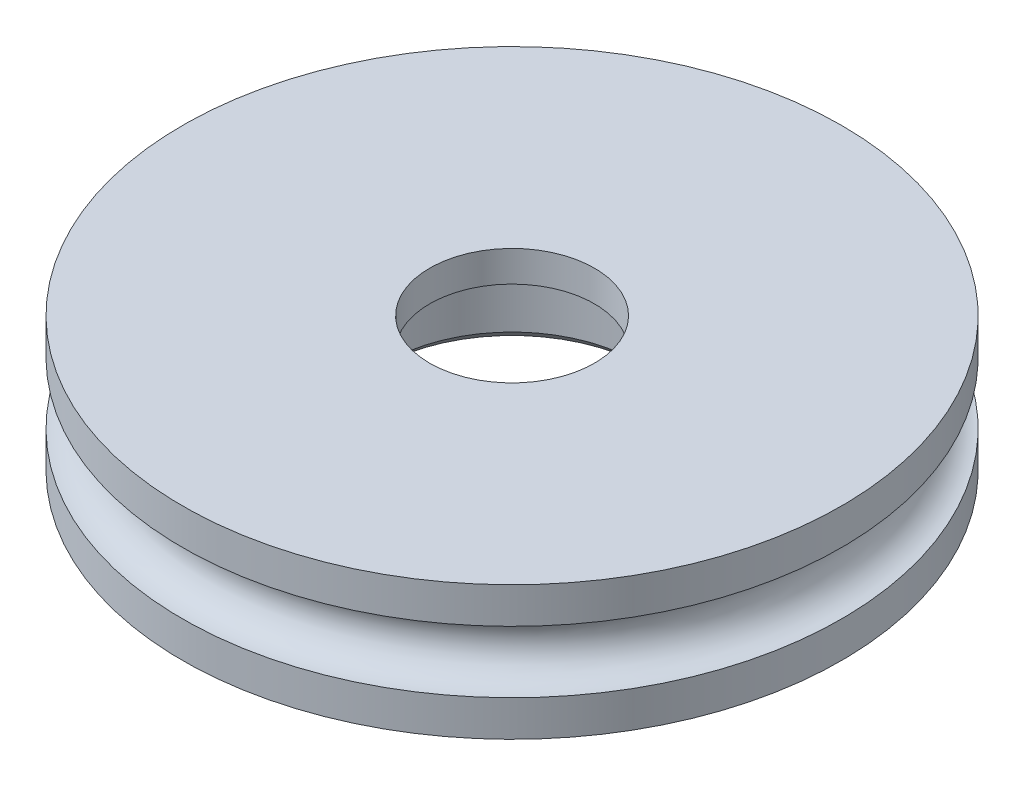
ISO-10303-21;
HEADER;
FILE_DESCRIPTION(('STEP AP214'),'2;1');
FILE_NAME('part.step','',(''),(''),'','','');
FILE_SCHEMA(('AUTOMOTIVE_DESIGN { 1 0 10303 214 1 1 1 1 }'));
ENDSEC;
DATA;
#1=APPLICATION_CONTEXT('core data for automotive mechanical design processes');
#2=APPLICATION_PROTOCOL_DEFINITION('international standard','automotive_design',2000,#1);
#3=PRODUCT_CONTEXT('',#1,'mechanical');
#4=PRODUCT('Part','Part','',(#3));
#5=PRODUCT_RELATED_PRODUCT_CATEGORY('part','',(#4));
#6=PRODUCT_DEFINITION_FORMATION('','',#4);
#7=PRODUCT_DEFINITION_CONTEXT('part definition',#1,'design');
#8=PRODUCT_DEFINITION('design','',#6,#7);
#9=PRODUCT_DEFINITION_SHAPE('','',#8);
#10=(LENGTH_UNIT() NAMED_UNIT(*) SI_UNIT(.MILLI.,.METRE.));
#11=(NAMED_UNIT(*) PLANE_ANGLE_UNIT() SI_UNIT($,.RADIAN.));
#12=(NAMED_UNIT(*) SI_UNIT($,.STERADIAN.) SOLID_ANGLE_UNIT());
#13=UNCERTAINTY_MEASURE_WITH_UNIT(LENGTH_MEASURE(1.E-05),#10,'distance_accuracy_value','');
#14=(GEOMETRIC_REPRESENTATION_CONTEXT(3) GLOBAL_UNCERTAINTY_ASSIGNED_CONTEXT((#13)) GLOBAL_UNIT_ASSIGNED_CONTEXT((#10,
#11,#12)) REPRESENTATION_CONTEXT('',''));
#15=CARTESIAN_POINT('',(0.,0.,0.));
#16=DIRECTION('',(0.,0.,1.));
#17=DIRECTION('',(1.,0.,0.));
#18=AXIS2_PLACEMENT_3D('',#15,#16,#17);
#19=CARTESIAN_POINT('',(0.,1.625,0.));
#20=DIRECTION('',(0.,-1.,0.));
#21=DIRECTION('',(0.,0.,-1.));
#22=AXIS2_PLACEMENT_3D('',#19,#20,#21);
#23=CYLINDRICAL_SURFACE('',#22,3.05);
#24=CARTESIAN_POINT('',(0.,-0.874999999999982,0.));
#25=DIRECTION('',(0.,-1.,0.));
#26=DIRECTION('',(0.,0.,-1.));
#27=AXIS2_PLACEMENT_3D('',#24,#25,#26);
#28=CIRCLE('',#27,3.05);
#29=CARTESIAN_POINT('',(0.,-0.874999999999982,-3.05));
#30=VERTEX_POINT('',#29);
#31=EDGE_CURVE('E43',#30,#30,#28,.T.);
#32=CARTESIAN_POINT('',(0.,0.875,0.));
#33=DIRECTION('',(0.,1.,0.));
#34=DIRECTION('',(0.,0.,1.));
#35=AXIS2_PLACEMENT_3D('',#32,#33,#34);
#36=CIRCLE('',#35,3.05);
#37=CARTESIAN_POINT('',(0.,0.875,-3.05));
#38=VERTEX_POINT('',#37);
#39=EDGE_CURVE('E54',#38,#38,#36,.T.);
#40=CARTESIAN_POINT('',(0.,-0.874999999999982,-3.05));
#41=CARTESIAN_POINT('',(0.,-0.856770833333315,-3.05));
#42=CARTESIAN_POINT('',(0.,-0.838541666666649,-3.05));
#43=CARTESIAN_POINT('',(0.,-0.802083333333316,-3.05));
#44=CARTESIAN_POINT('',(0.,-0.78385416666665,-3.05));
#45=CARTESIAN_POINT('',(0.,-0.747395833333317,-3.05));
#46=CARTESIAN_POINT('',(0.,-0.72916666666665,-3.05));
#47=CARTESIAN_POINT('',(0.,-0.692708333333317,-3.05));
#48=CARTESIAN_POINT('',(0.,-0.674479166666651,-3.05));
#49=CARTESIAN_POINT('',(0.,-0.638020833333318,-3.05));
#50=CARTESIAN_POINT('',(0.,-0.619791666666651,-3.05));
#51=CARTESIAN_POINT('',(0.,-0.583333333333318,-3.05));
#52=CARTESIAN_POINT('',(0.,-0.565104166666652,-3.05));
#53=CARTESIAN_POINT('',(0.,-0.528645833333319,-3.05));
#54=CARTESIAN_POINT('',(0.,-0.510416666666652,-3.05));
#55=CARTESIAN_POINT('',(0.,-0.473958333333319,-3.05));
#56=CARTESIAN_POINT('',(0.,-0.455729166666653,-3.05));
#57=CARTESIAN_POINT('',(0.,-0.41927083333332,-3.05));
#58=CARTESIAN_POINT('',(0.,-0.401041666666654,-3.05));
#59=CARTESIAN_POINT('',(0.,-0.364583333333321,-3.05));
#60=CARTESIAN_POINT('',(0.,-0.346354166666654,-3.05));
#61=CARTESIAN_POINT('',(0.,-0.309895833333321,-3.05));
#62=CARTESIAN_POINT('',(0.,-0.291666666666655,-3.05));
#63=CARTESIAN_POINT('',(0.,-0.255208333333322,-3.05));
#64=CARTESIAN_POINT('',(0.,-0.236979166666655,-3.05));
#65=CARTESIAN_POINT('',(0.,-0.200520833333322,-3.05));
#66=CARTESIAN_POINT('',(0.,-0.182291666666656,-3.05));
#67=CARTESIAN_POINT('',(0.,-0.145833333333323,-3.05));
#68=CARTESIAN_POINT('',(0.,-0.127604166666657,-3.05));
#69=CARTESIAN_POINT('',(0.,-0.0911458333333236,-3.05));
#70=CARTESIAN_POINT('',(0.,-0.0729166666666571,-3.05));
#71=CARTESIAN_POINT('',(0.,-0.036458333333324,-3.05));
#72=CARTESIAN_POINT('',(0.,-0.0182291666666576,-3.05));
#73=CARTESIAN_POINT('',(0.,0.0182291666666754,-3.05));
#74=CARTESIAN_POINT('',(0.,0.0364583333333418,-3.05));
#75=CARTESIAN_POINT('',(0.,0.0729166666666747,-3.05));
#76=CARTESIAN_POINT('',(0.,0.0911458333333412,-3.05));
#77=CARTESIAN_POINT('',(0.,0.127604166666674,-3.05));
#78=CARTESIAN_POINT('',(0.,0.145833333333341,-3.05));
#79=CARTESIAN_POINT('',(0.,0.182291666666674,-3.05));
#80=CARTESIAN_POINT('',(0.,0.20052083333334,-3.05));
#81=CARTESIAN_POINT('',(0.,0.236979166666673,-3.05));
#82=CARTESIAN_POINT('',(0.,0.25520833333334,-3.05));
#83=CARTESIAN_POINT('',(0.,0.291666666666673,-3.05));
#84=CARTESIAN_POINT('',(0.,0.309895833333339,-3.05));
#85=CARTESIAN_POINT('',(0.,0.346354166666672,-3.05));
#86=CARTESIAN_POINT('',(0.,0.364583333333338,-3.05));
#87=CARTESIAN_POINT('',(0.,0.401041666666671,-3.05));
#88=CARTESIAN_POINT('',(0.,0.419270833333338,-3.05));
#89=CARTESIAN_POINT('',(0.,0.455729166666671,-3.05));
#90=CARTESIAN_POINT('',(0.,0.473958333333337,-3.05));
#91=CARTESIAN_POINT('',(0.,0.51041666666667,-3.05));
#92=CARTESIAN_POINT('',(0.,0.528645833333337,-3.05));
#93=CARTESIAN_POINT('',(0.,0.56510416666667,-3.05));
#94=CARTESIAN_POINT('',(0.,0.583333333333336,-3.05));
#95=CARTESIAN_POINT('',(0.,0.619791666666669,-3.05));
#96=CARTESIAN_POINT('',(0.,0.638020833333336,-3.05));
#97=CARTESIAN_POINT('',(0.,0.674479166666669,-3.05));
#98=CARTESIAN_POINT('',(0.,0.692708333333335,-3.05));
#99=CARTESIAN_POINT('',(0.,0.729166666666668,-3.05));
#100=CARTESIAN_POINT('',(0.,0.747395833333334,-3.05));
#101=CARTESIAN_POINT('',(0.,0.783854166666668,-3.05));
#102=CARTESIAN_POINT('',(0.,0.802083333333334,-3.05));
#103=CARTESIAN_POINT('',(0.,0.838541666666667,-3.05));
#104=CARTESIAN_POINT('',(0.,0.856770833333333,-3.05));
#105=CARTESIAN_POINT('',(0.,0.875,-3.05));
#106=B_SPLINE_CURVE_WITH_KNOTS('',3,(#40,#41,#42,#43,#44,#45,#46,#47,#48,#49,#50,#51,#52,#53,
#54,#55,#56,#57,#58,#59,#60,#61,#62,#63,#64,#65,#66,#67,#68,#69,#70,#71,#72,#73,#74,#75,#76,#77,
#78,#79,#80,#81,#82,#83,#84,#85,#86,#87,#88,#89,#90,#91,#92,#93,#94,#95,#96,#97,#98,#99,#100,
#101,#102,#103,#104,#105),.UNSPECIFIED.,.F.,.F.,(4,2,2,2,2,2,2,2,2,2,2,2,2,2,2,2,2,2,2,2,2,2,2,
2,2,2,2,2,2,2,2,2,4),(0.,0.0546874999999996,0.109374999999999,0.164062499999998,
0.218749999999998,0.273437499999997,0.328124999999997,0.382812499999996,0.437499999999996,
0.492187499999995,0.546874999999994,0.601562499999994,0.656249999999993,0.710937499999993,
0.765624999999992,0.820312499999991,0.874999999999991,0.92968749999999,0.98437499999999,
1.03906249999999,1.09374999999999,1.14843749999999,1.20312499999999,1.25781249999999,
1.31249999999999,1.36718749999999,1.42187499999999,1.47656249999998,1.53124999999998,
1.58593749999998,1.64062499999998,1.69531249999998,1.74999999999998),.UNSPECIFIED.);
#107=EDGE_CURVE('BSEAM35',#30,#38,#106,.T.);
#108=ORIENTED_EDGE('',*,*,#31,.T.);
#109=ORIENTED_EDGE('',*,*,#39,.T.);
#110=ORIENTED_EDGE('',*,*,#107,.T.);
#111=ORIENTED_EDGE('',*,*,#107,.F.);
#112=EDGE_LOOP('',(#108,#110,#109,#111));
#113=FACE_BOUND('',#112,.T.);
#114=ADVANCED_FACE('F35',(#113),#23,.F.);
#115=CARTESIAN_POINT('',(0.,1.625,0.));
#116=DIRECTION('',(0.,-1.,0.));
#117=DIRECTION('',(0.,0.,-1.));
#118=AXIS2_PLACEMENT_3D('',#115,#116,#117);
#119=CYLINDRICAL_SURFACE('',#118,8.);
#120=CARTESIAN_POINT('',(0.,0.75,0.));
#121=DIRECTION('',(0.,1.,0.));
#122=DIRECTION('',(0.,0.,1.));
#123=AXIS2_PLACEMENT_3D('',#120,#121,#122);
#124=CIRCLE('',#123,8.);
#125=CARTESIAN_POINT('',(0.,0.75,-8.));
#126=VERTEX_POINT('',#125);
#127=EDGE_CURVE('E60',#126,#126,#124,.T.);
#128=CARTESIAN_POINT('',(0.,1.625,0.));
#129=DIRECTION('',(0.,1.,0.));
#130=DIRECTION('',(0.,0.,1.));
#131=AXIS2_PLACEMENT_3D('',#128,#129,#130);
#132=CIRCLE('',#131,8.);
#133=CARTESIAN_POINT('',(0.,1.625,-8.));
#134=VERTEX_POINT('',#133);
#135=EDGE_CURVE('E47',#134,#134,#132,.T.);
#136=CARTESIAN_POINT('',(0.,0.75,-8.));
#137=CARTESIAN_POINT('',(0.,0.759114583333333,-8.));
#138=CARTESIAN_POINT('',(0.,0.768229166666667,-8.));
#139=CARTESIAN_POINT('',(0.,0.786458333333333,-8.));
#140=CARTESIAN_POINT('',(0.,0.795572916666667,-8.));
#141=CARTESIAN_POINT('',(0.,0.813802083333333,-8.));
#142=CARTESIAN_POINT('',(0.,0.822916666666667,-8.));
#143=CARTESIAN_POINT('',(0.,0.841145833333333,-8.));
#144=CARTESIAN_POINT('',(0.,0.850260416666667,-8.));
#145=CARTESIAN_POINT('',(0.,0.868489583333333,-8.));
#146=CARTESIAN_POINT('',(0.,0.877604166666667,-8.));
#147=CARTESIAN_POINT('',(0.,0.895833333333333,-8.));
#148=CARTESIAN_POINT('',(0.,0.904947916666667,-8.));
#149=CARTESIAN_POINT('',(0.,0.923177083333333,-8.));
#150=CARTESIAN_POINT('',(0.,0.932291666666667,-8.));
#151=CARTESIAN_POINT('',(0.,0.950520833333333,-8.));
#152=CARTESIAN_POINT('',(0.,0.959635416666667,-8.));
#153=CARTESIAN_POINT('',(0.,0.977864583333333,-8.));
#154=CARTESIAN_POINT('',(0.,0.986979166666667,-8.));
#155=CARTESIAN_POINT('',(0.,1.00520833333333,-8.));
#156=CARTESIAN_POINT('',(0.,1.01432291666667,-8.));
#157=CARTESIAN_POINT('',(0.,1.03255208333333,-8.));
#158=CARTESIAN_POINT('',(0.,1.04166666666667,-8.));
#159=CARTESIAN_POINT('',(0.,1.05989583333333,-8.));
#160=CARTESIAN_POINT('',(0.,1.06901041666667,-8.));
#161=CARTESIAN_POINT('',(0.,1.08723958333333,-8.));
#162=CARTESIAN_POINT('',(0.,1.09635416666667,-8.));
#163=CARTESIAN_POINT('',(0.,1.11458333333333,-8.));
#164=CARTESIAN_POINT('',(0.,1.12369791666667,-8.));
#165=CARTESIAN_POINT('',(0.,1.14192708333333,-8.));
#166=CARTESIAN_POINT('',(0.,1.15104166666667,-8.));
#167=CARTESIAN_POINT('',(0.,1.16927083333333,-8.));
#168=CARTESIAN_POINT('',(0.,1.17838541666667,-8.));
#169=CARTESIAN_POINT('',(0.,1.19661458333333,-8.));
#170=CARTESIAN_POINT('',(0.,1.20572916666667,-8.));
#171=CARTESIAN_POINT('',(0.,1.22395833333333,-8.));
#172=CARTESIAN_POINT('',(0.,1.23307291666667,-8.));
#173=CARTESIAN_POINT('',(0.,1.25130208333333,-8.));
#174=CARTESIAN_POINT('',(0.,1.26041666666667,-8.));
#175=CARTESIAN_POINT('',(0.,1.27864583333333,-8.));
#176=CARTESIAN_POINT('',(0.,1.28776041666667,-8.));
#177=CARTESIAN_POINT('',(0.,1.30598958333333,-8.));
#178=CARTESIAN_POINT('',(0.,1.31510416666667,-8.));
#179=CARTESIAN_POINT('',(0.,1.33333333333333,-8.));
#180=CARTESIAN_POINT('',(0.,1.34244791666667,-8.));
#181=CARTESIAN_POINT('',(0.,1.36067708333333,-8.));
#182=CARTESIAN_POINT('',(0.,1.36979166666667,-8.));
#183=CARTESIAN_POINT('',(0.,1.38802083333333,-8.));
#184=CARTESIAN_POINT('',(0.,1.39713541666667,-8.));
#185=CARTESIAN_POINT('',(0.,1.41536458333333,-8.));
#186=CARTESIAN_POINT('',(0.,1.42447916666667,-8.));
#187=CARTESIAN_POINT('',(0.,1.44270833333333,-8.));
#188=CARTESIAN_POINT('',(0.,1.45182291666667,-8.));
#189=CARTESIAN_POINT('',(0.,1.47005208333333,-8.));
#190=CARTESIAN_POINT('',(0.,1.47916666666667,-8.));
#191=CARTESIAN_POINT('',(0.,1.49739583333333,-8.));
#192=CARTESIAN_POINT('',(0.,1.50651041666667,-8.));
#193=CARTESIAN_POINT('',(0.,1.52473958333333,-8.));
#194=CARTESIAN_POINT('',(0.,1.53385416666667,-8.));
#195=CARTESIAN_POINT('',(0.,1.55208333333333,-8.));
#196=CARTESIAN_POINT('',(0.,1.56119791666667,-8.));
#197=CARTESIAN_POINT('',(0.,1.57942708333333,-8.));
#198=CARTESIAN_POINT('',(0.,1.58854166666667,-8.));
#199=CARTESIAN_POINT('',(0.,1.60677083333333,-8.));
#200=CARTESIAN_POINT('',(0.,1.61588541666667,-8.));
#201=CARTESIAN_POINT('',(0.,1.625,-8.));
#202=B_SPLINE_CURVE_WITH_KNOTS('',3,(#136,#137,#138,#139,#140,#141,#142,#143,#144,#145,#146,
#147,#148,#149,#150,#151,#152,#153,#154,#155,#156,#157,#158,#159,#160,#161,#162,#163,#164,#165,
#166,#167,#168,#169,#170,#171,#172,#173,#174,#175,#176,#177,#178,#179,#180,#181,#182,#183,#184,
#185,#186,#187,#188,#189,#190,#191,#192,#193,#194,#195,#196,#197,#198,#199,#200,#201),
.UNSPECIFIED.,.F.,.F.,(4,2,2,2,2,2,2,2,2,2,2,2,2,2,2,2,2,2,2,2,2,2,2,2,2,2,2,2,2,2,2,2,4),(0.,
0.02734375,0.0546874999999999,0.08203125,0.109375,0.13671875,0.1640625,0.19140625,0.21875,
0.24609375,0.2734375,0.30078125,0.328125,0.35546875,0.3828125,0.41015625,0.4375,0.46484375,
0.4921875,0.51953125,0.546875,0.57421875,0.6015625,0.62890625,0.65625,0.68359375,0.7109375,
0.73828125,0.765625,0.79296875,0.8203125,0.84765625,0.875),.UNSPECIFIED.);
#203=EDGE_CURVE('BSEAM81',#126,#134,#202,.T.);
#204=ORIENTED_EDGE('',*,*,#127,.T.);
#205=ORIENTED_EDGE('',*,*,#135,.F.);
#206=ORIENTED_EDGE('',*,*,#203,.T.);
#207=ORIENTED_EDGE('',*,*,#203,.F.);
#208=EDGE_LOOP('',(#204,#206,#205,#207));
#209=FACE_BOUND('',#208,.T.);
#210=ADVANCED_FACE('F81',(#209),#119,.T.);
#211=CARTESIAN_POINT('',(0.,1.625,0.));
#212=DIRECTION('',(0.,1.,0.));
#213=DIRECTION('',(0.,0.,1.));
#214=AXIS2_PLACEMENT_3D('',#211,#212,#213);
#215=PLANE('',#214);
#216=ORIENTED_EDGE('',*,*,#135,.T.);
#217=EDGE_LOOP('',(#216));
#218=FACE_BOUND('',#217,.T.);
#219=CARTESIAN_POINT('',(0.,1.625,0.));
#220=DIRECTION('',(0.,1.,0.));
#221=DIRECTION('',(0.,0.,1.));
#222=AXIS2_PLACEMENT_3D('',#219,#220,#221);
#223=CIRCLE('',#222,2.);
#224=CARTESIAN_POINT('',(0.,1.625,2.));
#225=VERTEX_POINT('',#224);
#226=EDGE_CURVE('E68',#225,#225,#223,.T.);
#227=ORIENTED_EDGE('',*,*,#226,.F.);
#228=EDGE_LOOP('',(#227));
#229=FACE_BOUND('',#228,.T.);
#230=ADVANCED_FACE('F82',(#218,#229),#215,.T.);
#231=CARTESIAN_POINT('',(0.,-1.625,0.));
#232=DIRECTION('',(0.,1.,0.));
#233=DIRECTION('',(0.,0.,1.));
#234=AXIS2_PLACEMENT_3D('',#231,#232,#233);
#235=PLANE('',#234);
#236=CARTESIAN_POINT('',(0.,-1.625,0.));
#237=DIRECTION('',(0.,-1.,0.));
#238=DIRECTION('',(0.,0.,-1.));
#239=AXIS2_PLACEMENT_3D('',#236,#237,#238);
#240=CIRCLE('',#239,6.5);
#241=CARTESIAN_POINT('',(0.,-1.625,-6.5));
#242=VERTEX_POINT('',#241);
#243=EDGE_CURVE('E109',#242,#242,#240,.T.);
#244=ORIENTED_EDGE('',*,*,#243,.F.);
#245=EDGE_LOOP('',(#244));
#246=FACE_BOUND('',#245,.T.);
#247=CARTESIAN_POINT('',(0.,-1.625,0.));
#248=DIRECTION('',(0.,1.,0.));
#249=DIRECTION('',(0.,0.,1.));
#250=AXIS2_PLACEMENT_3D('',#247,#248,#249);
#251=CIRCLE('',#250,8.);
#252=CARTESIAN_POINT('',(0.,-1.625,-8.));
#253=VERTEX_POINT('',#252);
#254=EDGE_CURVE('E51',#253,#253,#251,.T.);
#255=ORIENTED_EDGE('',*,*,#254,.F.);
#256=EDGE_LOOP('',(#255));
#257=FACE_BOUND('',#256,.T.);
#258=ADVANCED_FACE('F85',(#246,#257),#235,.F.);
#259=CARTESIAN_POINT('',(0.,-0.75,0.));
#260=DIRECTION('',(0.,1.,0.));
#261=DIRECTION('',(0.,0.,1.));
#262=AXIS2_PLACEMENT_3D('',#259,#260,#261);
#263=CIRCLE('',#262,8.);
#264=CARTESIAN_POINT('',(0.,-0.75,-8.));
#265=VERTEX_POINT('',#264);
#266=EDGE_CURVE('E57',#265,#265,#263,.T.);
#267=CARTESIAN_POINT('',(0.,-0.75,-8.));
#268=CARTESIAN_POINT('',(0.,-0.759114583333333,-8.));
#269=CARTESIAN_POINT('',(0.,-0.768229166666667,-8.));
#270=CARTESIAN_POINT('',(0.,-0.786458333333333,-8.));
#271=CARTESIAN_POINT('',(0.,-0.795572916666667,-8.));
#272=CARTESIAN_POINT('',(0.,-0.813802083333333,-8.));
#273=CARTESIAN_POINT('',(0.,-0.822916666666667,-8.));
#274=CARTESIAN_POINT('',(0.,-0.841145833333333,-8.));
#275=CARTESIAN_POINT('',(0.,-0.850260416666667,-8.));
#276=CARTESIAN_POINT('',(0.,-0.868489583333333,-8.));
#277=CARTESIAN_POINT('',(0.,-0.877604166666667,-8.));
#278=CARTESIAN_POINT('',(0.,-0.895833333333333,-8.));
#279=CARTESIAN_POINT('',(0.,-0.904947916666667,-8.));
#280=CARTESIAN_POINT('',(0.,-0.923177083333333,-8.));
#281=CARTESIAN_POINT('',(0.,-0.932291666666667,-8.));
#282=CARTESIAN_POINT('',(0.,-0.950520833333333,-8.));
#283=CARTESIAN_POINT('',(0.,-0.959635416666667,-8.));
#284=CARTESIAN_POINT('',(0.,-0.977864583333333,-8.));
#285=CARTESIAN_POINT('',(0.,-0.986979166666667,-8.));
#286=CARTESIAN_POINT('',(0.,-1.00520833333333,-8.));
#287=CARTESIAN_POINT('',(0.,-1.01432291666667,-8.));
#288=CARTESIAN_POINT('',(0.,-1.03255208333333,-8.));
#289=CARTESIAN_POINT('',(0.,-1.04166666666667,-8.));
#290=CARTESIAN_POINT('',(0.,-1.05989583333333,-8.));
#291=CARTESIAN_POINT('',(0.,-1.06901041666667,-8.));
#292=CARTESIAN_POINT('',(0.,-1.08723958333333,-8.));
#293=CARTESIAN_POINT('',(0.,-1.09635416666667,-8.));
#294=CARTESIAN_POINT('',(0.,-1.11458333333333,-8.));
#295=CARTESIAN_POINT('',(0.,-1.12369791666667,-8.));
#296=CARTESIAN_POINT('',(0.,-1.14192708333333,-8.));
#297=CARTESIAN_POINT('',(0.,-1.15104166666667,-8.));
#298=CARTESIAN_POINT('',(0.,-1.16927083333333,-8.));
#299=CARTESIAN_POINT('',(0.,-1.17838541666667,-8.));
#300=CARTESIAN_POINT('',(0.,-1.19661458333333,-8.));
#301=CARTESIAN_POINT('',(0.,-1.20572916666667,-8.));
#302=CARTESIAN_POINT('',(0.,-1.22395833333333,-8.));
#303=CARTESIAN_POINT('',(0.,-1.23307291666667,-8.));
#304=CARTESIAN_POINT('',(0.,-1.25130208333333,-8.));
#305=CARTESIAN_POINT('',(0.,-1.26041666666667,-8.));
#306=CARTESIAN_POINT('',(0.,-1.27864583333333,-8.));
#307=CARTESIAN_POINT('',(0.,-1.28776041666667,-8.));
#308=CARTESIAN_POINT('',(0.,-1.30598958333333,-8.));
#309=CARTESIAN_POINT('',(0.,-1.31510416666667,-8.));
#310=CARTESIAN_POINT('',(0.,-1.33333333333333,-8.));
#311=CARTESIAN_POINT('',(0.,-1.34244791666667,-8.));
#312=CARTESIAN_POINT('',(0.,-1.36067708333333,-8.));
#313=CARTESIAN_POINT('',(0.,-1.36979166666667,-8.));
#314=CARTESIAN_POINT('',(0.,-1.38802083333333,-8.));
#315=CARTESIAN_POINT('',(0.,-1.39713541666667,-8.));
#316=CARTESIAN_POINT('',(0.,-1.41536458333333,-8.));
#317=CARTESIAN_POINT('',(0.,-1.42447916666667,-8.));
#318=CARTESIAN_POINT('',(0.,-1.44270833333333,-8.));
#319=CARTESIAN_POINT('',(0.,-1.45182291666667,-8.));
#320=CARTESIAN_POINT('',(0.,-1.47005208333333,-8.));
#321=CARTESIAN_POINT('',(0.,-1.47916666666667,-8.));
#322=CARTESIAN_POINT('',(0.,-1.49739583333333,-8.));
#323=CARTESIAN_POINT('',(0.,-1.50651041666667,-8.));
#324=CARTESIAN_POINT('',(0.,-1.52473958333333,-8.));
#325=CARTESIAN_POINT('',(0.,-1.53385416666667,-8.));
#326=CARTESIAN_POINT('',(0.,-1.55208333333333,-8.));
#327=CARTESIAN_POINT('',(0.,-1.56119791666667,-8.));
#328=CARTESIAN_POINT('',(0.,-1.57942708333333,-8.));
#329=CARTESIAN_POINT('',(0.,-1.58854166666667,-8.));
#330=CARTESIAN_POINT('',(0.,-1.60677083333333,-8.));
#331=CARTESIAN_POINT('',(0.,-1.61588541666667,-8.));
#332=CARTESIAN_POINT('',(0.,-1.625,-8.));
#333=B_SPLINE_CURVE_WITH_KNOTS('',3,(#267,#268,#269,#270,#271,#272,#273,#274,#275,#276,#277,
#278,#279,#280,#281,#282,#283,#284,#285,#286,#287,#288,#289,#290,#291,#292,#293,#294,#295,#296,
#297,#298,#299,#300,#301,#302,#303,#304,#305,#306,#307,#308,#309,#310,#311,#312,#313,#314,#315,
#316,#317,#318,#319,#320,#321,#322,#323,#324,#325,#326,#327,#328,#329,#330,#331,#332),
.UNSPECIFIED.,.F.,.F.,(4,2,2,2,2,2,2,2,2,2,2,2,2,2,2,2,2,2,2,2,2,2,2,2,2,2,2,2,2,2,2,2,4),(0.,
0.02734375,0.0546875,0.0820312500000001,0.109375,0.13671875,0.1640625,0.19140625,0.21875,
0.24609375,0.2734375,0.30078125,0.328125,0.35546875,0.3828125,0.41015625,0.4375,0.46484375,
0.4921875,0.51953125,0.546875,0.57421875,0.6015625,0.62890625,0.65625,0.68359375,0.7109375,
0.73828125,0.765625,0.79296875,0.8203125,0.84765625,0.875),.UNSPECIFIED.);
#334=EDGE_CURVE('BSEAM76',#265,#253,#333,.T.);
#335=ORIENTED_EDGE('',*,*,#266,.F.);
#336=ORIENTED_EDGE('',*,*,#254,.T.);
#337=ORIENTED_EDGE('',*,*,#334,.T.);
#338=ORIENTED_EDGE('',*,*,#334,.F.);
#339=EDGE_LOOP('',(#335,#337,#336,#338));
#340=FACE_BOUND('',#339,.T.);
#341=ADVANCED_FACE('F76',(#340),#119,.T.);
#342=CARTESIAN_POINT('',(0.,0.,8.));
#343=DIRECTION('',(1.,0.,0.));
#344=DIRECTION('',(0.,1.,0.));
#345=AXIS2_PLACEMENT_3D('',#342,#343,#344);
#346=ELLIPSE('',#345,0.75,0.75);
#347=CARTESIAN_POINT('',(0.,1.625,0.));
#348=DIRECTION('',(0.,1.,0.));
#349=AXIS1_PLACEMENT('',#347,#348);
#350=SURFACE_OF_REVOLUTION('',#346,#349);
#351=ORIENTED_EDGE('',*,*,#127,.F.);
#352=EDGE_LOOP('',(#351));
#353=FACE_BOUND('',#352,.T.);
#354=ORIENTED_EDGE('',*,*,#266,.T.);
#355=EDGE_LOOP('',(#354));
#356=FACE_BOUND('',#355,.T.);
#357=ADVANCED_FACE('F71',(#353,#356),#350,.T.);
#358=CARTESIAN_POINT('',(0.,0.875,0.));
#359=DIRECTION('',(0.,1.,0.));
#360=DIRECTION('',(0.,0.,1.));
#361=AXIS2_PLACEMENT_3D('',#358,#359,#360);
#362=PLANE('',#361);
#363=CARTESIAN_POINT('',(0.,0.875,0.));
#364=DIRECTION('',(0.,1.,0.));
#365=DIRECTION('',(0.,0.,1.));
#366=AXIS2_PLACEMENT_3D('',#363,#364,#365);
#367=CIRCLE('',#366,2.);
#368=CARTESIAN_POINT('',(0.,0.875,2.));
#369=VERTEX_POINT('',#368);
#370=EDGE_CURVE('E58',#369,#369,#367,.T.);
#371=ORIENTED_EDGE('',*,*,#370,.T.);
#372=EDGE_LOOP('',(#371));
#373=FACE_BOUND('',#372,.T.);
#374=ORIENTED_EDGE('',*,*,#39,.F.);
#375=EDGE_LOOP('',(#374));
#376=FACE_BOUND('',#375,.T.);
#377=ADVANCED_FACE('F75',(#373,#376),#362,.F.);
#378=CARTESIAN_POINT('',(0.,0.875,0.));
#379=DIRECTION('',(0.,1.,0.));
#380=DIRECTION('',(0.,0.,1.));
#381=AXIS2_PLACEMENT_3D('',#378,#379,#380);
#382=CYLINDRICAL_SURFACE('',#381,2.);
#383=ORIENTED_EDGE('',*,*,#370,.F.);
#384=EDGE_LOOP('',(#383));
#385=FACE_BOUND('',#384,.T.);
#386=ORIENTED_EDGE('',*,*,#226,.T.);
#387=EDGE_LOOP('',(#386));
#388=FACE_BOUND('',#387,.T.);
#389=ADVANCED_FACE('F122',(#385,#388),#382,.F.);
#390=CARTESIAN_POINT('',(0.,-1.125,0.));
#391=DIRECTION('',(0.,-1.,0.));
#392=DIRECTION('',(0.,0.,-1.));
#393=AXIS2_PLACEMENT_3D('',#390,#391,#392);
#394=CYLINDRICAL_SURFACE('',#393,6.5);
#395=CARTESIAN_POINT('',(0.,-1.125,0.));
#396=DIRECTION('',(0.,-1.,0.));
#397=DIRECTION('',(0.,0.,-1.));
#398=AXIS2_PLACEMENT_3D('',#395,#396,#397);
#399=CIRCLE('',#398,6.5);
#400=CARTESIAN_POINT('',(0.,-1.125,-6.5));
#401=VERTEX_POINT('',#400);
#402=EDGE_CURVE('E106',#401,#401,#399,.T.);
#403=ORIENTED_EDGE('',*,*,#402,.F.);
#404=EDGE_LOOP('',(#403));
#405=FACE_BOUND('',#404,.T.);
#406=ORIENTED_EDGE('',*,*,#243,.T.);
#407=EDGE_LOOP('',(#406));
#408=FACE_BOUND('',#407,.T.);
#409=ADVANCED_FACE('F117',(#405,#408),#394,.F.);
#410=CARTESIAN_POINT('',(0.,-1.125,0.));
#411=DIRECTION('',(0.,-1.,0.));
#412=DIRECTION('',(0.,0.,-1.));
#413=AXIS2_PLACEMENT_3D('',#410,#411,#412);
#414=PLANE('',#413);
#415=CARTESIAN_POINT('',(0.,-1.125,0.));
#416=DIRECTION('',(0.,-1.,0.));
#417=DIRECTION('',(0.,0.,-1.));
#418=AXIS2_PLACEMENT_3D('',#415,#416,#417);
#419=CIRCLE('',#418,3.30000000000002);
#420=CARTESIAN_POINT('',(0.,-1.125,-3.30000000000002));
#421=VERTEX_POINT('',#420);
#422=EDGE_CURVE('E10',#421,#421,#419,.F.);
#423=ORIENTED_EDGE('',*,*,#422,.T.);
#424=EDGE_LOOP('',(#423));
#425=FACE_BOUND('',#424,.T.);
#426=ORIENTED_EDGE('',*,*,#402,.T.);
#427=EDGE_LOOP('',(#426));
#428=FACE_BOUND('',#427,.T.);
#429=ADVANCED_FACE('F121',(#425,#428),#414,.T.);
#430=CARTESIAN_POINT('',(0.,-0.874999999999982,0.));
#431=DIRECTION('',(0.,-1.,0.));
#432=DIRECTION('',(0.,0.,-1.));
#433=AXIS2_PLACEMENT_3D('',#430,#431,#432);
#434=CONICAL_SURFACE('',#433,3.05,0.785398163397447);
#435=ORIENTED_EDGE('',*,*,#422,.F.);
#436=EDGE_LOOP('',(#435));
#437=FACE_BOUND('',#436,.T.);
#438=ORIENTED_EDGE('',*,*,#31,.F.);
#439=EDGE_LOOP('',(#438));
#440=FACE_BOUND('',#439,.T.);
#441=ADVANCED_FACE('F38',(#437,#440),#434,.F.);
#442=CLOSED_SHELL('',(#114,#210,#230,#258,#341,#357,#377,#389,#409,#429,#441));
#443=MANIFOLD_SOLID_BREP('B2',#442);
#444=ADVANCED_BREP_SHAPE_REPRESENTATION('',(#18,#443),#14);
#445=SHAPE_DEFINITION_REPRESENTATION(#9,#444);
ENDSEC;
END-ISO-10303-21;
